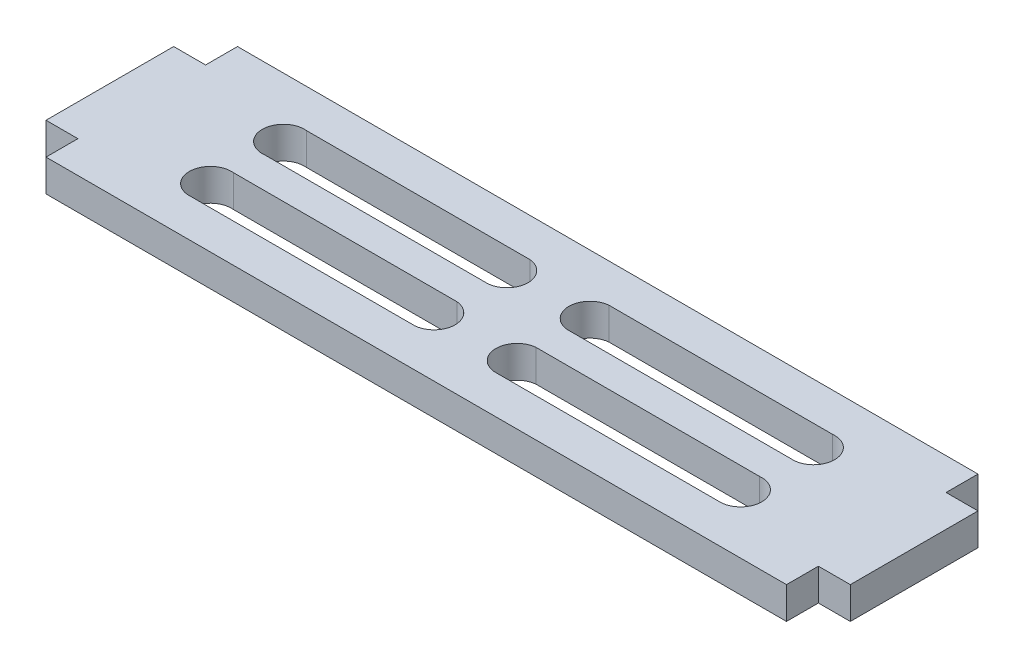
ISO-10303-21;
HEADER;
FILE_DESCRIPTION(('STEP AP214'),'2;1');
FILE_NAME('part.step','',(''),(''),'','','');
FILE_SCHEMA(('AUTOMOTIVE_DESIGN { 1 0 10303 214 1 1 1 1 }'));
ENDSEC;
DATA;
#1=APPLICATION_CONTEXT('core data for automotive mechanical design processes');
#2=APPLICATION_PROTOCOL_DEFINITION('international standard','automotive_design',2000,#1);
#3=PRODUCT_CONTEXT('',#1,'mechanical');
#4=PRODUCT('Part','Part','',(#3));
#5=PRODUCT_RELATED_PRODUCT_CATEGORY('part','',(#4));
#6=PRODUCT_DEFINITION_FORMATION('','',#4);
#7=PRODUCT_DEFINITION_CONTEXT('part definition',#1,'design');
#8=PRODUCT_DEFINITION('design','',#6,#7);
#9=PRODUCT_DEFINITION_SHAPE('','',#8);
#10=(LENGTH_UNIT() NAMED_UNIT(*) SI_UNIT(.MILLI.,.METRE.));
#11=(NAMED_UNIT(*) PLANE_ANGLE_UNIT() SI_UNIT($,.RADIAN.));
#12=(NAMED_UNIT(*) SI_UNIT($,.STERADIAN.) SOLID_ANGLE_UNIT());
#13=UNCERTAINTY_MEASURE_WITH_UNIT(LENGTH_MEASURE(1.E-05),#10,'distance_accuracy_value','');
#14=(GEOMETRIC_REPRESENTATION_CONTEXT(3) GLOBAL_UNCERTAINTY_ASSIGNED_CONTEXT((#13)) GLOBAL_UNIT_ASSIGNED_CONTEXT((#10,
#11,#12)) REPRESENTATION_CONTEXT('',''));
#15=CARTESIAN_POINT('',(0.,0.,0.));
#16=DIRECTION('',(0.,0.,1.));
#17=DIRECTION('',(1.,0.,0.));
#18=AXIS2_PLACEMENT_3D('',#15,#16,#17);
#19=CARTESIAN_POINT('',(0.,5.,0.));
#20=DIRECTION('',(0.,1.,0.));
#21=DIRECTION('',(0.,0.,1.));
#22=AXIS2_PLACEMENT_3D('',#19,#20,#21);
#23=PLANE('',#22);
#24=DIRECTION('',(0.,0.,-1.));
#25=VECTOR('',#24,1.);
#26=CARTESIAN_POINT('',(95.0892982050154,5.,11.6910229031955));
#27=LINE('',#26,#25);
#28=CARTESIAN_POINT('',(95.0892982050154,5.,16.6910229031955));
#29=VERTEX_POINT('',#28);
#30=CARTESIAN_POINT('',(95.0892982050154,5.,11.6910229031955));
#31=VERTEX_POINT('',#30);
#32=EDGE_CURVE('E349',#29,#31,#27,.T.);
#33=ORIENTED_EDGE('',*,*,#32,.T.);
#34=DIRECTION('',(1.,0.,0.));
#35=VECTOR('',#34,1.);
#36=CARTESIAN_POINT('',(95.0892982050154,5.,11.6910229031955));
#37=LINE('',#36,#35);
#38=CARTESIAN_POINT('',(100.089298205015,5.,11.6910229031955));
#39=VERTEX_POINT('',#38);
#40=EDGE_CURVE('E352',#31,#39,#37,.T.);
#41=ORIENTED_EDGE('',*,*,#40,.T.);
#42=DIRECTION('',(0.,0.,-1.));
#43=VECTOR('',#42,1.);
#44=CARTESIAN_POINT('',(100.089298205015,5.,-8.30897709680451));
#45=LINE('',#44,#43);
#46=CARTESIAN_POINT('',(100.089298205015,5.,-8.30897709680451));
#47=VERTEX_POINT('',#46);
#48=EDGE_CURVE('E355',#39,#47,#45,.T.);
#49=ORIENTED_EDGE('',*,*,#48,.T.);
#50=DIRECTION('',(-1.,0.,0.));
#51=VECTOR('',#50,1.);
#52=CARTESIAN_POINT('',(95.0892982050154,5.,-8.30897709680451));
#53=LINE('',#52,#51);
#54=CARTESIAN_POINT('',(95.0892982050154,5.,-8.30897709680451));
#55=VERTEX_POINT('',#54);
#56=EDGE_CURVE('E357',#47,#55,#53,.T.);
#57=ORIENTED_EDGE('',*,*,#56,.T.);
#58=DIRECTION('',(0.,0.,-1.));
#59=VECTOR('',#58,1.);
#60=CARTESIAN_POINT('',(95.0892982050154,5.,-13.3089770968045));
#61=LINE('',#60,#59);
#62=CARTESIAN_POINT('',(95.0892982050154,5.,-13.3089770968045));
#63=VERTEX_POINT('',#62);
#64=EDGE_CURVE('E359',#55,#63,#61,.T.);
#65=ORIENTED_EDGE('',*,*,#64,.T.);
#66=DIRECTION('',(-1.,0.,0.));
#67=VECTOR('',#66,1.);
#68=CARTESIAN_POINT('',(51.5892982050154,5.,-13.3089770968045));
#69=LINE('',#68,#67);
#70=CARTESIAN_POINT('',(-20.9107017949846,5.,-13.3089770968045));
#71=VERTEX_POINT('',#70);
#72=EDGE_CURVE('E361',#63,#71,#69,.T.);
#73=ORIENTED_EDGE('',*,*,#72,.T.);
#74=DIRECTION('',(0.,0.,1.));
#75=VECTOR('',#74,1.);
#76=CARTESIAN_POINT('',(-20.9107017949846,5.,-13.3089770968045));
#77=LINE('',#76,#75);
#78=CARTESIAN_POINT('',(-20.9107017949846,5.,-8.30897709680451));
#79=VERTEX_POINT('',#78);
#80=EDGE_CURVE('E363',#71,#79,#77,.T.);
#81=ORIENTED_EDGE('',*,*,#80,.T.);
#82=DIRECTION('',(-1.,0.,0.));
#83=VECTOR('',#82,1.);
#84=CARTESIAN_POINT('',(-20.9107017949846,5.,-8.30897709680451));
#85=LINE('',#84,#83);
#86=CARTESIAN_POINT('',(-25.9107017949846,5.,-8.30897709680452));
#87=VERTEX_POINT('',#86);
#88=EDGE_CURVE('E365',#79,#87,#85,.T.);
#89=ORIENTED_EDGE('',*,*,#88,.T.);
#90=DIRECTION('',(0.,0.,1.));
#91=VECTOR('',#90,1.);
#92=CARTESIAN_POINT('',(-25.9107017949846,5.,-8.30897709680452));
#93=LINE('',#92,#91);
#94=CARTESIAN_POINT('',(-25.9107017949846,5.,11.6910229031955));
#95=VERTEX_POINT('',#94);
#96=EDGE_CURVE('E367',#87,#95,#93,.T.);
#97=ORIENTED_EDGE('',*,*,#96,.T.);
#98=DIRECTION('',(1.,0.,0.));
#99=VECTOR('',#98,1.);
#100=CARTESIAN_POINT('',(-20.9107017949846,5.,11.6910229031955));
#101=LINE('',#100,#99);
#102=CARTESIAN_POINT('',(-20.9107017949846,5.,11.6910229031955));
#103=VERTEX_POINT('',#102);
#104=EDGE_CURVE('E369',#95,#103,#101,.T.);
#105=ORIENTED_EDGE('',*,*,#104,.T.);
#106=DIRECTION('',(0.,0.,1.));
#107=VECTOR('',#106,1.);
#108=CARTESIAN_POINT('',(-20.9107017949846,5.,11.6910229031955));
#109=LINE('',#108,#107);
#110=CARTESIAN_POINT('',(-20.9107017949846,5.,16.6910229031955));
#111=VERTEX_POINT('',#110);
#112=EDGE_CURVE('E371',#103,#111,#109,.T.);
#113=ORIENTED_EDGE('',*,*,#112,.T.);
#114=DIRECTION('',(1.,0.,0.));
#115=VECTOR('',#114,1.);
#116=CARTESIAN_POINT('',(-20.9107017949846,5.,16.6910229031955));
#117=LINE('',#116,#115);
#118=EDGE_CURVE('E373',#111,#29,#117,.T.);
#119=ORIENTED_EDGE('',*,*,#118,.T.);
#120=EDGE_LOOP('',(#33,#41,#49,#57,#65,#73,#81,#89,#97,#105,#113,#119));
#121=FACE_BOUND('',#120,.T.);
#122=DIRECTION('',(1.,0.,0.));
#123=VECTOR('',#122,1.);
#124=CARTESIAN_POINT('',(-4.09292982060812,5.,10.6910229031955));
#125=LINE('',#124,#123);
#126=CARTESIAN_POINT('',(-4.09292982060812,5.,10.6910229031955));
#127=VERTEX_POINT('',#126);
#128=CARTESIAN_POINT('',(30.9070701793919,5.,10.6910229031955));
#129=VERTEX_POINT('',#128);
#130=EDGE_CURVE('E320',#127,#129,#125,.T.);
#131=ORIENTED_EDGE('',*,*,#130,.F.);
#132=CARTESIAN_POINT('',(-4.43867562482222,5.,7.40643776316124));
#133=DIRECTION('',(0.,1.,0.));
#134=DIRECTION('',(0.,0.,1.));
#135=AXIS2_PLACEMENT_3D('',#132,#133,#134);
#136=CIRCLE('',#135,3.30273215736084);
#137=CARTESIAN_POINT('',(-4.0929298206081,5.,4.121852623127));
#138=VERTEX_POINT('',#137);
#139=EDGE_CURVE('E318',#138,#127,#136,.T.);
#140=ORIENTED_EDGE('',*,*,#139,.F.);
#141=DIRECTION('',(-1.,0.,0.));
#142=VECTOR('',#141,1.);
#143=CARTESIAN_POINT('',(-4.0929298206081,5.,4.121852623127));
#144=LINE('',#143,#142);
#145=CARTESIAN_POINT('',(30.9070701793919,5.,4.121852623127));
#146=VERTEX_POINT('',#145);
#147=EDGE_CURVE('E326',#146,#138,#144,.T.);
#148=ORIENTED_EDGE('',*,*,#147,.F.);
#149=CARTESIAN_POINT('',(30.5884788143704,5.,7.40643776316124));
#150=DIRECTION('',(0.,1.,0.));
#151=DIRECTION('',(0.,0.,-1.));
#152=AXIS2_PLACEMENT_3D('',#149,#150,#151);
#153=CIRCLE('',#152,3.3);
#154=EDGE_CURVE('E323',#129,#146,#153,.T.);
#155=ORIENTED_EDGE('',*,*,#154,.F.);
#156=EDGE_LOOP('',(#131,#140,#148,#155));
#157=FACE_BOUND('',#156,.T.);
#158=DIRECTION('',(-1.,0.,0.));
#159=VECTOR('',#158,1.);
#160=CARTESIAN_POINT('',(-4.09292982060812,5.,-7.3089770968045));
#161=LINE('',#160,#159);
#162=CARTESIAN_POINT('',(30.9070701793919,5.,-7.3089770968045));
#163=VERTEX_POINT('',#162);
#164=CARTESIAN_POINT('',(-4.09292982060812,5.,-7.3089770968045));
#165=VERTEX_POINT('',#164);
#166=EDGE_CURVE('E289',#163,#165,#161,.T.);
#167=ORIENTED_EDGE('',*,*,#166,.F.);
#168=CARTESIAN_POINT('',(30.5884788143704,5.,-4.02439195677026));
#169=DIRECTION('',(0.,1.,0.));
#170=DIRECTION('',(0.,0.,1.));
#171=AXIS2_PLACEMENT_3D('',#168,#169,#170);
#172=CIRCLE('',#171,3.3);
#173=CARTESIAN_POINT('',(30.9070701793919,5.,-0.739806816736021));
#174=VERTEX_POINT('',#173);
#175=EDGE_CURVE('E287',#174,#163,#172,.T.);
#176=ORIENTED_EDGE('',*,*,#175,.F.);
#177=DIRECTION('',(1.,0.,0.));
#178=VECTOR('',#177,1.);
#179=CARTESIAN_POINT('',(-4.0929298206081,5.,-0.739806816736021));
#180=LINE('',#179,#178);
#181=CARTESIAN_POINT('',(-4.0929298206081,5.,-0.739806816736021));
#182=VERTEX_POINT('',#181);
#183=EDGE_CURVE('E295',#182,#174,#180,.T.);
#184=ORIENTED_EDGE('',*,*,#183,.F.);
#185=CARTESIAN_POINT('',(-4.43867562482222,5.,-4.02439195677026));
#186=DIRECTION('',(0.,1.,0.));
#187=DIRECTION('',(0.,0.,-1.));
#188=AXIS2_PLACEMENT_3D('',#185,#186,#187);
#189=CIRCLE('',#188,3.30273215736084);
#190=EDGE_CURVE('E292',#165,#182,#189,.T.);
#191=ORIENTED_EDGE('',*,*,#190,.F.);
#192=EDGE_LOOP('',(#167,#176,#184,#191));
#193=FACE_BOUND('',#192,.T.);
#194=DIRECTION('',(1.,0.,0.));
#195=VECTOR('',#194,1.);
#196=CARTESIAN_POINT('',(78.2715262306389,5.,10.6910229031955));
#197=LINE('',#196,#195);
#198=CARTESIAN_POINT('',(43.2715262306389,5.,10.6910229031955));
#199=VERTEX_POINT('',#198);
#200=CARTESIAN_POINT('',(78.2715262306389,5.,10.6910229031955));
#201=VERTEX_POINT('',#200);
#202=EDGE_CURVE('E258',#199,#201,#197,.T.);
#203=ORIENTED_EDGE('',*,*,#202,.F.);
#204=CARTESIAN_POINT('',(43.5901175956604,5.,7.40643776316123));
#205=DIRECTION('',(0.,1.,0.));
#206=DIRECTION('',(0.,0.,1.));
#207=AXIS2_PLACEMENT_3D('',#204,#205,#206);
#208=CIRCLE('',#207,3.3);
#209=CARTESIAN_POINT('',(43.2715262306389,5.,4.12185262312699));
#210=VERTEX_POINT('',#209);
#211=EDGE_CURVE('E256',#210,#199,#208,.T.);
#212=ORIENTED_EDGE('',*,*,#211,.F.);
#213=DIRECTION('',(-1.,0.,0.));
#214=VECTOR('',#213,1.);
#215=CARTESIAN_POINT('',(78.2715262306389,5.,4.12185262312699));
#216=LINE('',#215,#214);
#217=CARTESIAN_POINT('',(78.2715262306389,5.,4.12185262312699));
#218=VERTEX_POINT('',#217);
#219=EDGE_CURVE('E264',#218,#210,#216,.T.);
#220=ORIENTED_EDGE('',*,*,#219,.F.);
#221=CARTESIAN_POINT('',(78.617272034853,5.,7.40643776316123));
#222=DIRECTION('',(0.,1.,0.));
#223=DIRECTION('',(0.,0.,-1.));
#224=AXIS2_PLACEMENT_3D('',#221,#222,#223);
#225=CIRCLE('',#224,3.30273215736084);
#226=EDGE_CURVE('E261',#201,#218,#225,.T.);
#227=ORIENTED_EDGE('',*,*,#226,.F.);
#228=EDGE_LOOP('',(#203,#212,#220,#227));
#229=FACE_BOUND('',#228,.T.);
#230=DIRECTION('',(-1.,0.,0.));
#231=VECTOR('',#230,1.);
#232=CARTESIAN_POINT('',(78.2715262306389,5.,-7.30897709680449));
#233=LINE('',#232,#231);
#234=CARTESIAN_POINT('',(78.2715262306389,5.,-7.30897709680449));
#235=VERTEX_POINT('',#234);
#236=CARTESIAN_POINT('',(43.2715262306389,5.,-7.30897709680449));
#237=VERTEX_POINT('',#236);
#238=EDGE_CURVE('E228',#235,#237,#233,.T.);
#239=ORIENTED_EDGE('',*,*,#238,.F.);
#240=CARTESIAN_POINT('',(78.617272034853,5.,-4.02439195677025));
#241=DIRECTION('',(0.,1.,0.));
#242=DIRECTION('',(0.,0.,1.));
#243=AXIS2_PLACEMENT_3D('',#240,#241,#242);
#244=CIRCLE('',#243,3.30273215736084);
#245=CARTESIAN_POINT('',(78.2715262306389,5.,-0.739806816736014));
#246=VERTEX_POINT('',#245);
#247=EDGE_CURVE('E220',#246,#235,#244,.T.);
#248=ORIENTED_EDGE('',*,*,#247,.F.);
#249=DIRECTION('',(1.,0.,0.));
#250=VECTOR('',#249,1.);
#251=CARTESIAN_POINT('',(78.2715262306389,5.,-0.739806816736014));
#252=LINE('',#251,#250);
#253=CARTESIAN_POINT('',(43.2715262306389,5.,-0.739806816736014));
#254=VERTEX_POINT('',#253);
#255=EDGE_CURVE('E242',#254,#246,#252,.T.);
#256=ORIENTED_EDGE('',*,*,#255,.F.);
#257=CARTESIAN_POINT('',(43.5901175956604,5.,-4.02439195677025));
#258=DIRECTION('',(0.,1.,0.));
#259=DIRECTION('',(0.,0.,-1.));
#260=AXIS2_PLACEMENT_3D('',#257,#258,#259);
#261=CIRCLE('',#260,3.3);
#262=EDGE_CURVE('E240',#237,#254,#261,.T.);
#263=ORIENTED_EDGE('',*,*,#262,.F.);
#264=EDGE_LOOP('',(#239,#248,#256,#263));
#265=FACE_BOUND('',#264,.T.);
#266=ADVANCED_FACE('F35',(#121,#157,#193,#229,#265),#23,.T.);
#267=CARTESIAN_POINT('',(0.,0.,0.));
#268=DIRECTION('',(0.,1.,0.));
#269=DIRECTION('',(0.,0.,1.));
#270=AXIS2_PLACEMENT_3D('',#267,#268,#269);
#271=PLANE('',#270);
#272=CARTESIAN_POINT('',(43.5901175956604,0.,7.40643776316123));
#273=DIRECTION('',(0.,1.,0.));
#274=DIRECTION('',(0.,0.,1.));
#275=AXIS2_PLACEMENT_3D('',#272,#273,#274);
#276=CIRCLE('',#275,3.3);
#277=CARTESIAN_POINT('',(43.2715262306389,0.,4.12185262312699));
#278=VERTEX_POINT('',#277);
#279=CARTESIAN_POINT('',(43.2715262306389,0.,10.6910229031955));
#280=VERTEX_POINT('',#279);
#281=EDGE_CURVE('E236',#278,#280,#276,.T.);
#282=ORIENTED_EDGE('',*,*,#281,.T.);
#283=DIRECTION('',(1.,0.,0.));
#284=VECTOR('',#283,1.);
#285=CARTESIAN_POINT('',(78.2715262306389,0.,10.6910229031955));
#286=LINE('',#285,#284);
#287=CARTESIAN_POINT('',(78.2715262306389,0.,10.6910229031955));
#288=VERTEX_POINT('',#287);
#289=EDGE_CURVE('E269',#280,#288,#286,.T.);
#290=ORIENTED_EDGE('',*,*,#289,.T.);
#291=CARTESIAN_POINT('',(78.617272034853,0.,7.40643776316123));
#292=DIRECTION('',(0.,1.,0.));
#293=DIRECTION('',(0.,0.,-1.));
#294=AXIS2_PLACEMENT_3D('',#291,#292,#293);
#295=CIRCLE('',#294,3.30273215736084);
#296=CARTESIAN_POINT('',(78.2715262306389,0.,4.12185262312699));
#297=VERTEX_POINT('',#296);
#298=EDGE_CURVE('E272',#288,#297,#295,.T.);
#299=ORIENTED_EDGE('',*,*,#298,.T.);
#300=DIRECTION('',(-1.,0.,0.));
#301=VECTOR('',#300,1.);
#302=CARTESIAN_POINT('',(78.2715262306389,0.,4.12185262312699));
#303=LINE('',#302,#301);
#304=EDGE_CURVE('E259',#297,#278,#303,.T.);
#305=ORIENTED_EDGE('',*,*,#304,.T.);
#306=EDGE_LOOP('',(#282,#290,#299,#305));
#307=FACE_BOUND('',#306,.T.);
#308=CARTESIAN_POINT('',(-4.43867562482222,0.,7.40643776316124));
#309=DIRECTION('',(0.,1.,0.));
#310=DIRECTION('',(0.,0.,1.));
#311=AXIS2_PLACEMENT_3D('',#308,#309,#310);
#312=CIRCLE('',#311,3.30273215736084);
#313=CARTESIAN_POINT('',(-4.0929298206081,0.,4.121852623127));
#314=VERTEX_POINT('',#313);
#315=CARTESIAN_POINT('',(-4.09292982060812,0.,10.6910229031955));
#316=VERTEX_POINT('',#315);
#317=EDGE_CURVE('E317',#314,#316,#312,.T.);
#318=ORIENTED_EDGE('',*,*,#317,.T.);
#319=DIRECTION('',(1.,0.,0.));
#320=VECTOR('',#319,1.);
#321=CARTESIAN_POINT('',(-4.09292982060812,0.,10.6910229031955));
#322=LINE('',#321,#320);
#323=CARTESIAN_POINT('',(30.9070701793919,0.,10.6910229031955));
#324=VERTEX_POINT('',#323);
#325=EDGE_CURVE('E331',#316,#324,#322,.T.);
#326=ORIENTED_EDGE('',*,*,#325,.T.);
#327=CARTESIAN_POINT('',(30.5884788143704,0.,7.40643776316124));
#328=DIRECTION('',(0.,1.,0.));
#329=DIRECTION('',(0.,0.,-1.));
#330=AXIS2_PLACEMENT_3D('',#327,#328,#329);
#331=CIRCLE('',#330,3.3);
#332=CARTESIAN_POINT('',(30.9070701793919,0.,4.121852623127));
#333=VERTEX_POINT('',#332);
#334=EDGE_CURVE('E334',#324,#333,#331,.T.);
#335=ORIENTED_EDGE('',*,*,#334,.T.);
#336=DIRECTION('',(-1.,0.,0.));
#337=VECTOR('',#336,1.);
#338=CARTESIAN_POINT('',(-4.0929298206081,0.,4.121852623127));
#339=LINE('',#338,#337);
#340=EDGE_CURVE('E321',#333,#314,#339,.T.);
#341=ORIENTED_EDGE('',*,*,#340,.T.);
#342=EDGE_LOOP('',(#318,#326,#335,#341));
#343=FACE_BOUND('',#342,.T.);
#344=DIRECTION('',(0.,0.,-1.));
#345=VECTOR('',#344,1.);
#346=CARTESIAN_POINT('',(95.0892982050154,0.,11.6910229031955));
#347=LINE('',#346,#345);
#348=CARTESIAN_POINT('',(95.0892982050154,0.,16.6910229031955));
#349=VERTEX_POINT('',#348);
#350=CARTESIAN_POINT('',(95.0892982050154,0.,11.6910229031955));
#351=VERTEX_POINT('',#350);
#352=EDGE_CURVE('E348',#349,#351,#347,.T.);
#353=ORIENTED_EDGE('',*,*,#352,.F.);
#354=DIRECTION('',(1.,0.,0.));
#355=VECTOR('',#354,1.);
#356=CARTESIAN_POINT('',(-20.9107017949846,0.,16.6910229031955));
#357=LINE('',#356,#355);
#358=CARTESIAN_POINT('',(-20.9107017949846,0.,16.6910229031955));
#359=VERTEX_POINT('',#358);
#360=EDGE_CURVE('E353',#359,#349,#357,.T.);
#361=ORIENTED_EDGE('',*,*,#360,.F.);
#362=DIRECTION('',(0.,0.,1.));
#363=VECTOR('',#362,1.);
#364=CARTESIAN_POINT('',(-20.9107017949846,0.,11.6910229031955));
#365=LINE('',#364,#363);
#366=CARTESIAN_POINT('',(-20.9107017949846,0.,11.6910229031955));
#367=VERTEX_POINT('',#366);
#368=EDGE_CURVE('E397',#367,#359,#365,.T.);
#369=ORIENTED_EDGE('',*,*,#368,.F.);
#370=DIRECTION('',(1.,0.,0.));
#371=VECTOR('',#370,1.);
#372=CARTESIAN_POINT('',(-20.9107017949846,0.,11.6910229031955));
#373=LINE('',#372,#371);
#374=CARTESIAN_POINT('',(-25.9107017949846,0.,11.6910229031955));
#375=VERTEX_POINT('',#374);
#376=EDGE_CURVE('E395',#375,#367,#373,.T.);
#377=ORIENTED_EDGE('',*,*,#376,.F.);
#378=DIRECTION('',(0.,0.,1.));
#379=VECTOR('',#378,1.);
#380=CARTESIAN_POINT('',(-25.9107017949846,0.,-8.30897709680452));
#381=LINE('',#380,#379);
#382=CARTESIAN_POINT('',(-25.9107017949846,0.,-8.30897709680452));
#383=VERTEX_POINT('',#382);
#384=EDGE_CURVE('E393',#383,#375,#381,.T.);
#385=ORIENTED_EDGE('',*,*,#384,.F.);
#386=DIRECTION('',(-1.,0.,0.));
#387=VECTOR('',#386,1.);
#388=CARTESIAN_POINT('',(-20.9107017949846,0.,-8.30897709680451));
#389=LINE('',#388,#387);
#390=CARTESIAN_POINT('',(-20.9107017949846,0.,-8.30897709680451));
#391=VERTEX_POINT('',#390);
#392=EDGE_CURVE('E391',#391,#383,#389,.T.);
#393=ORIENTED_EDGE('',*,*,#392,.F.);
#394=DIRECTION('',(0.,0.,1.));
#395=VECTOR('',#394,1.);
#396=CARTESIAN_POINT('',(-20.9107017949846,0.,-13.3089770968045));
#397=LINE('',#396,#395);
#398=CARTESIAN_POINT('',(-20.9107017949846,0.,-13.3089770968045));
#399=VERTEX_POINT('',#398);
#400=EDGE_CURVE('E389',#399,#391,#397,.T.);
#401=ORIENTED_EDGE('',*,*,#400,.F.);
#402=DIRECTION('',(-1.,0.,0.));
#403=VECTOR('',#402,1.);
#404=CARTESIAN_POINT('',(22.5892982050154,0.,-13.3089770968045));
#405=LINE('',#404,#403);
#406=CARTESIAN_POINT('',(95.0892982050154,0.,-13.3089770968045));
#407=VERTEX_POINT('',#406);
#408=EDGE_CURVE('E387',#407,#399,#405,.T.);
#409=ORIENTED_EDGE('',*,*,#408,.F.);
#410=DIRECTION('',(0.,0.,-1.));
#411=VECTOR('',#410,1.);
#412=CARTESIAN_POINT('',(95.0892982050154,0.,-13.3089770968045));
#413=LINE('',#412,#411);
#414=CARTESIAN_POINT('',(95.0892982050154,0.,-8.30897709680451));
#415=VERTEX_POINT('',#414);
#416=EDGE_CURVE('E384',#415,#407,#413,.T.);
#417=ORIENTED_EDGE('',*,*,#416,.F.);
#418=DIRECTION('',(-1.,0.,0.));
#419=VECTOR('',#418,1.);
#420=CARTESIAN_POINT('',(95.0892982050154,0.,-8.30897709680451));
#421=LINE('',#420,#419);
#422=CARTESIAN_POINT('',(100.089298205015,0.,-8.30897709680451));
#423=VERTEX_POINT('',#422);
#424=EDGE_CURVE('E382',#423,#415,#421,.T.);
#425=ORIENTED_EDGE('',*,*,#424,.F.);
#426=DIRECTION('',(0.,0.,-1.));
#427=VECTOR('',#426,1.);
#428=CARTESIAN_POINT('',(100.089298205015,0.,-8.30897709680451));
#429=LINE('',#428,#427);
#430=CARTESIAN_POINT('',(100.089298205015,0.,11.6910229031955));
#431=VERTEX_POINT('',#430);
#432=EDGE_CURVE('E380',#431,#423,#429,.T.);
#433=ORIENTED_EDGE('',*,*,#432,.F.);
#434=DIRECTION('',(1.,0.,0.));
#435=VECTOR('',#434,1.);
#436=CARTESIAN_POINT('',(95.0892982050154,0.,11.6910229031955));
#437=LINE('',#436,#435);
#438=EDGE_CURVE('E378',#351,#431,#437,.T.);
#439=ORIENTED_EDGE('',*,*,#438,.F.);
#440=EDGE_LOOP('',(#353,#361,#369,#377,#385,#393,#401,#409,#417,#425,#433,#439));
#441=FACE_BOUND('',#440,.T.);
#442=CARTESIAN_POINT('',(30.5884788143704,0.,-4.02439195677026));
#443=DIRECTION('',(0.,1.,0.));
#444=DIRECTION('',(0.,0.,1.));
#445=AXIS2_PLACEMENT_3D('',#442,#443,#444);
#446=CIRCLE('',#445,3.3);
#447=CARTESIAN_POINT('',(30.9070701793919,0.,-0.739806816736021));
#448=VERTEX_POINT('',#447);
#449=CARTESIAN_POINT('',(30.9070701793919,0.,-7.3089770968045));
#450=VERTEX_POINT('',#449);
#451=EDGE_CURVE('E286',#448,#450,#446,.T.);
#452=ORIENTED_EDGE('',*,*,#451,.T.);
#453=DIRECTION('',(-1.,0.,0.));
#454=VECTOR('',#453,1.);
#455=CARTESIAN_POINT('',(-4.09292982060812,0.,-7.3089770968045));
#456=LINE('',#455,#454);
#457=CARTESIAN_POINT('',(-4.09292982060812,0.,-7.3089770968045));
#458=VERTEX_POINT('',#457);
#459=EDGE_CURVE('E300',#450,#458,#456,.T.);
#460=ORIENTED_EDGE('',*,*,#459,.T.);
#461=CARTESIAN_POINT('',(-4.43867562482222,0.,-4.02439195677026));
#462=DIRECTION('',(0.,1.,0.));
#463=DIRECTION('',(0.,0.,-1.));
#464=AXIS2_PLACEMENT_3D('',#461,#462,#463);
#465=CIRCLE('',#464,3.30273215736084);
#466=CARTESIAN_POINT('',(-4.0929298206081,0.,-0.739806816736021));
#467=VERTEX_POINT('',#466);
#468=EDGE_CURVE('E303',#458,#467,#465,.T.);
#469=ORIENTED_EDGE('',*,*,#468,.T.);
#470=DIRECTION('',(1.,0.,0.));
#471=VECTOR('',#470,1.);
#472=CARTESIAN_POINT('',(-4.0929298206081,0.,-0.739806816736021));
#473=LINE('',#472,#471);
#474=EDGE_CURVE('E290',#467,#448,#473,.T.);
#475=ORIENTED_EDGE('',*,*,#474,.T.);
#476=EDGE_LOOP('',(#452,#460,#469,#475));
#477=FACE_BOUND('',#476,.T.);
#478=CARTESIAN_POINT('',(78.617272034853,0.,-4.02439195677025));
#479=DIRECTION('',(0.,1.,0.));
#480=DIRECTION('',(0.,0.,1.));
#481=AXIS2_PLACEMENT_3D('',#478,#479,#480);
#482=CIRCLE('',#481,3.30273215736084);
#483=CARTESIAN_POINT('',(78.2715262306389,0.,-0.739806816736014));
#484=VERTEX_POINT('',#483);
#485=CARTESIAN_POINT('',(78.2715262306389,0.,-7.30897709680449));
#486=VERTEX_POINT('',#485);
#487=EDGE_CURVE('E58',#484,#486,#482,.T.);
#488=ORIENTED_EDGE('',*,*,#487,.T.);
#489=DIRECTION('',(-1.,0.,0.));
#490=VECTOR('',#489,1.);
#491=CARTESIAN_POINT('',(78.2715262306389,0.,-7.30897709680449));
#492=LINE('',#491,#490);
#493=CARTESIAN_POINT('',(43.2715262306389,0.,-7.30897709680449));
#494=VERTEX_POINT('',#493);
#495=EDGE_CURVE('E235',#486,#494,#492,.T.);
#496=ORIENTED_EDGE('',*,*,#495,.T.);
#497=CARTESIAN_POINT('',(43.5901175956604,0.,-4.02439195677025));
#498=DIRECTION('',(0.,1.,0.));
#499=DIRECTION('',(0.,0.,-1.));
#500=AXIS2_PLACEMENT_3D('',#497,#498,#499);
#501=CIRCLE('',#500,3.3);
#502=CARTESIAN_POINT('',(43.2715262306389,0.,-0.739806816736014));
#503=VERTEX_POINT('',#502);
#504=EDGE_CURVE('E248',#494,#503,#501,.T.);
#505=ORIENTED_EDGE('',*,*,#504,.T.);
#506=DIRECTION('',(1.,0.,0.));
#507=VECTOR('',#506,1.);
#508=CARTESIAN_POINT('',(78.2715262306389,0.,-0.739806816736014));
#509=LINE('',#508,#507);
#510=EDGE_CURVE('E229',#503,#484,#509,.T.);
#511=ORIENTED_EDGE('',*,*,#510,.T.);
#512=EDGE_LOOP('',(#488,#496,#505,#511));
#513=FACE_BOUND('',#512,.T.);
#514=ADVANCED_FACE('F439',(#307,#343,#441,#477,#513),#271,.F.);
#515=CARTESIAN_POINT('',(95.0892982050154,5.,11.6910229031955));
#516=DIRECTION('',(-1.,0.,0.));
#517=DIRECTION('',(0.,0.,1.));
#518=AXIS2_PLACEMENT_3D('',#515,#516,#517);
#519=PLANE('',#518);
#520=ORIENTED_EDGE('',*,*,#352,.T.);
#521=DIRECTION('',(0.,-1.,0.));
#522=VECTOR('',#521,1.);
#523=CARTESIAN_POINT('',(95.0892982050154,5.,11.6910229031955));
#524=LINE('',#523,#522);
#525=EDGE_CURVE('E11',#31,#351,#524,.T.);
#526=ORIENTED_EDGE('',*,*,#525,.F.);
#527=ORIENTED_EDGE('',*,*,#32,.F.);
#528=DIRECTION('',(0.,-1.,0.));
#529=VECTOR('',#528,1.);
#530=CARTESIAN_POINT('',(95.0892982050154,5.,16.6910229031955));
#531=LINE('',#530,#529);
#532=EDGE_CURVE('E375',#29,#349,#531,.T.);
#533=ORIENTED_EDGE('',*,*,#532,.T.);
#534=EDGE_LOOP('',(#520,#526,#527,#533));
#535=FACE_BOUND('',#534,.T.);
#536=ADVANCED_FACE('F37',(#535),#519,.F.);
#537=CARTESIAN_POINT('',(95.0892982050154,5.,11.6910229031955));
#538=DIRECTION('',(0.,0.,-1.));
#539=DIRECTION('',(-1.,0.,0.));
#540=AXIS2_PLACEMENT_3D('',#537,#538,#539);
#541=PLANE('',#540);
#542=ORIENTED_EDGE('',*,*,#438,.T.);
#543=DIRECTION('',(0.,-1.,0.));
#544=VECTOR('',#543,1.);
#545=CARTESIAN_POINT('',(100.089298205015,5.,11.6910229031955));
#546=LINE('',#545,#544);
#547=EDGE_CURVE('E43',#39,#431,#546,.T.);
#548=ORIENTED_EDGE('',*,*,#547,.F.);
#549=ORIENTED_EDGE('',*,*,#40,.F.);
#550=ORIENTED_EDGE('',*,*,#525,.T.);
#551=EDGE_LOOP('',(#542,#548,#549,#550));
#552=FACE_BOUND('',#551,.T.);
#553=ADVANCED_FACE('F456',(#552),#541,.F.);
#554=CARTESIAN_POINT('',(100.089298205015,5.,-8.30897709680451));
#555=DIRECTION('',(-1.,0.,0.));
#556=DIRECTION('',(0.,0.,1.));
#557=AXIS2_PLACEMENT_3D('',#554,#555,#556);
#558=PLANE('',#557);
#559=ORIENTED_EDGE('',*,*,#432,.T.);
#560=DIRECTION('',(0.,-1.,0.));
#561=VECTOR('',#560,1.);
#562=CARTESIAN_POINT('',(100.089298205015,5.,-8.30897709680451));
#563=LINE('',#562,#561);
#564=EDGE_CURVE('E426',#47,#423,#563,.T.);
#565=ORIENTED_EDGE('',*,*,#564,.F.);
#566=ORIENTED_EDGE('',*,*,#48,.F.);
#567=ORIENTED_EDGE('',*,*,#547,.T.);
#568=EDGE_LOOP('',(#559,#565,#566,#567));
#569=FACE_BOUND('',#568,.T.);
#570=ADVANCED_FACE('F433',(#569),#558,.F.);
#571=CARTESIAN_POINT('',(95.0892982050154,5.,-8.30897709680451));
#572=DIRECTION('',(0.,0.,1.));
#573=DIRECTION('',(1.,0.,0.));
#574=AXIS2_PLACEMENT_3D('',#571,#572,#573);
#575=PLANE('',#574);
#576=ORIENTED_EDGE('',*,*,#424,.T.);
#577=DIRECTION('',(0.,-1.,0.));
#578=VECTOR('',#577,1.);
#579=CARTESIAN_POINT('',(95.0892982050154,5.,-8.30897709680451));
#580=LINE('',#579,#578);
#581=EDGE_CURVE('E423',#55,#415,#580,.T.);
#582=ORIENTED_EDGE('',*,*,#581,.F.);
#583=ORIENTED_EDGE('',*,*,#56,.F.);
#584=ORIENTED_EDGE('',*,*,#564,.T.);
#585=EDGE_LOOP('',(#576,#582,#583,#584));
#586=FACE_BOUND('',#585,.T.);
#587=ADVANCED_FACE('F444',(#586),#575,.F.);
#588=CARTESIAN_POINT('',(95.0892982050154,5.,-13.3089770968045));
#589=DIRECTION('',(-1.,0.,0.));
#590=DIRECTION('',(0.,0.,1.));
#591=AXIS2_PLACEMENT_3D('',#588,#589,#590);
#592=PLANE('',#591);
#593=ORIENTED_EDGE('',*,*,#416,.T.);
#594=DIRECTION('',(0.,-1.,0.));
#595=VECTOR('',#594,1.);
#596=CARTESIAN_POINT('',(95.0892982050154,5.,-13.3089770968045));
#597=LINE('',#596,#595);
#598=EDGE_CURVE('E420',#63,#407,#597,.T.);
#599=ORIENTED_EDGE('',*,*,#598,.F.);
#600=ORIENTED_EDGE('',*,*,#64,.F.);
#601=ORIENTED_EDGE('',*,*,#581,.T.);
#602=EDGE_LOOP('',(#593,#599,#600,#601));
#603=FACE_BOUND('',#602,.T.);
#604=ADVANCED_FACE('F448',(#603),#592,.F.);
#605=CARTESIAN_POINT('',(22.5892982050154,5.,-13.3089770968045));
#606=DIRECTION('',(0.,0.,1.));
#607=DIRECTION('',(1.,0.,0.));
#608=AXIS2_PLACEMENT_3D('',#605,#606,#607);
#609=PLANE('',#608);
#610=ORIENTED_EDGE('',*,*,#408,.T.);
#611=DIRECTION('',(0.,-1.,0.));
#612=VECTOR('',#611,1.);
#613=CARTESIAN_POINT('',(-20.9107017949846,5.,-13.3089770968045));
#614=LINE('',#613,#612);
#615=EDGE_CURVE('E417',#71,#399,#614,.T.);
#616=ORIENTED_EDGE('',*,*,#615,.F.);
#617=ORIENTED_EDGE('',*,*,#72,.F.);
#618=ORIENTED_EDGE('',*,*,#598,.T.);
#619=EDGE_LOOP('',(#610,#616,#617,#618));
#620=FACE_BOUND('',#619,.T.);
#621=ADVANCED_FACE('F489',(#620),#609,.F.);
#622=CARTESIAN_POINT('',(-20.9107017949846,5.,-13.3089770968045));
#623=DIRECTION('',(1.,0.,0.));
#624=DIRECTION('',(0.,0.,-1.));
#625=AXIS2_PLACEMENT_3D('',#622,#623,#624);
#626=PLANE('',#625);
#627=ORIENTED_EDGE('',*,*,#400,.T.);
#628=DIRECTION('',(0.,-1.,0.));
#629=VECTOR('',#628,1.);
#630=CARTESIAN_POINT('',(-20.9107017949846,5.,-8.30897709680451));
#631=LINE('',#630,#629);
#632=EDGE_CURVE('E414',#79,#391,#631,.T.);
#633=ORIENTED_EDGE('',*,*,#632,.F.);
#634=ORIENTED_EDGE('',*,*,#80,.F.);
#635=ORIENTED_EDGE('',*,*,#615,.T.);
#636=EDGE_LOOP('',(#627,#633,#634,#635));
#637=FACE_BOUND('',#636,.T.);
#638=ADVANCED_FACE('F487',(#637),#626,.F.);
#639=CARTESIAN_POINT('',(-20.9107017949846,5.,-8.30897709680451));
#640=DIRECTION('',(0.,0.,1.));
#641=DIRECTION('',(1.,0.,0.));
#642=AXIS2_PLACEMENT_3D('',#639,#640,#641);
#643=PLANE('',#642);
#644=ORIENTED_EDGE('',*,*,#392,.T.);
#645=DIRECTION('',(0.,-1.,0.));
#646=VECTOR('',#645,1.);
#647=CARTESIAN_POINT('',(-25.9107017949846,5.,-8.30897709680452));
#648=LINE('',#647,#646);
#649=EDGE_CURVE('E411',#87,#383,#648,.T.);
#650=ORIENTED_EDGE('',*,*,#649,.F.);
#651=ORIENTED_EDGE('',*,*,#88,.F.);
#652=ORIENTED_EDGE('',*,*,#632,.T.);
#653=EDGE_LOOP('',(#644,#650,#651,#652));
#654=FACE_BOUND('',#653,.T.);
#655=ADVANCED_FACE('F483',(#654),#643,.F.);
#656=CARTESIAN_POINT('',(-25.9107017949846,5.,-8.30897709680452));
#657=DIRECTION('',(1.,0.,0.));
#658=DIRECTION('',(0.,0.,-1.));
#659=AXIS2_PLACEMENT_3D('',#656,#657,#658);
#660=PLANE('',#659);
#661=ORIENTED_EDGE('',*,*,#384,.T.);
#662=DIRECTION('',(0.,-1.,0.));
#663=VECTOR('',#662,1.);
#664=CARTESIAN_POINT('',(-25.9107017949846,5.,11.6910229031955));
#665=LINE('',#664,#663);
#666=EDGE_CURVE('E408',#95,#375,#665,.T.);
#667=ORIENTED_EDGE('',*,*,#666,.F.);
#668=ORIENTED_EDGE('',*,*,#96,.F.);
#669=ORIENTED_EDGE('',*,*,#649,.T.);
#670=EDGE_LOOP('',(#661,#667,#668,#669));
#671=FACE_BOUND('',#670,.T.);
#672=ADVANCED_FACE('F478',(#671),#660,.F.);
#673=CARTESIAN_POINT('',(-20.9107017949846,5.,11.6910229031955));
#674=DIRECTION('',(0.,0.,-1.));
#675=DIRECTION('',(-1.,0.,0.));
#676=AXIS2_PLACEMENT_3D('',#673,#674,#675);
#677=PLANE('',#676);
#678=ORIENTED_EDGE('',*,*,#376,.T.);
#679=DIRECTION('',(0.,-1.,0.));
#680=VECTOR('',#679,1.);
#681=CARTESIAN_POINT('',(-20.9107017949846,5.,11.6910229031955));
#682=LINE('',#681,#680);
#683=EDGE_CURVE('E405',#103,#367,#682,.T.);
#684=ORIENTED_EDGE('',*,*,#683,.F.);
#685=ORIENTED_EDGE('',*,*,#104,.F.);
#686=ORIENTED_EDGE('',*,*,#666,.T.);
#687=EDGE_LOOP('',(#678,#684,#685,#686));
#688=FACE_BOUND('',#687,.T.);
#689=ADVANCED_FACE('F472',(#688),#677,.F.);
#690=CARTESIAN_POINT('',(-20.9107017949846,5.,11.6910229031955));
#691=DIRECTION('',(1.,0.,0.));
#692=DIRECTION('',(0.,0.,-1.));
#693=AXIS2_PLACEMENT_3D('',#690,#691,#692);
#694=PLANE('',#693);
#695=ORIENTED_EDGE('',*,*,#368,.T.);
#696=DIRECTION('',(0.,-1.,0.));
#697=VECTOR('',#696,1.);
#698=CARTESIAN_POINT('',(-20.9107017949846,5.,16.6910229031955));
#699=LINE('',#698,#697);
#700=EDGE_CURVE('E402',#111,#359,#699,.T.);
#701=ORIENTED_EDGE('',*,*,#700,.F.);
#702=ORIENTED_EDGE('',*,*,#112,.F.);
#703=ORIENTED_EDGE('',*,*,#683,.T.);
#704=EDGE_LOOP('',(#695,#701,#702,#703));
#705=FACE_BOUND('',#704,.T.);
#706=ADVANCED_FACE('F468',(#705),#694,.F.);
#707=CARTESIAN_POINT('',(-20.9107017949846,5.,16.6910229031955));
#708=DIRECTION('',(0.,0.,-1.));
#709=DIRECTION('',(-1.,0.,0.));
#710=AXIS2_PLACEMENT_3D('',#707,#708,#709);
#711=PLANE('',#710);
#712=ORIENTED_EDGE('',*,*,#360,.T.);
#713=ORIENTED_EDGE('',*,*,#532,.F.);
#714=ORIENTED_EDGE('',*,*,#118,.F.);
#715=ORIENTED_EDGE('',*,*,#700,.T.);
#716=EDGE_LOOP('',(#712,#713,#714,#715));
#717=FACE_BOUND('',#716,.T.);
#718=ADVANCED_FACE('F463',(#717),#711,.F.);
#719=CARTESIAN_POINT('',(-4.43867562482222,5.,7.40643776316124));
#720=DIRECTION('',(0.,-1.,0.));
#721=DIRECTION('',(0.,0.,-1.));
#722=AXIS2_PLACEMENT_3D('',#719,#720,#721);
#723=CYLINDRICAL_SURFACE('',#722,3.30273215736084);
#724=ORIENTED_EDGE('',*,*,#317,.F.);
#725=DIRECTION('',(0.,-1.,0.));
#726=VECTOR('',#725,1.);
#727=CARTESIAN_POINT('',(-4.0929298206081,5.,4.121852623127));
#728=LINE('',#727,#726);
#729=EDGE_CURVE('E328',#138,#314,#728,.T.);
#730=ORIENTED_EDGE('',*,*,#729,.F.);
#731=ORIENTED_EDGE('',*,*,#139,.T.);
#732=DIRECTION('',(0.,-1.,0.));
#733=VECTOR('',#732,1.);
#734=CARTESIAN_POINT('',(-4.09292982060812,5.,10.6910229031955));
#735=LINE('',#734,#733);
#736=EDGE_CURVE('E345',#127,#316,#735,.T.);
#737=ORIENTED_EDGE('',*,*,#736,.T.);
#738=EDGE_LOOP('',(#724,#730,#731,#737));
#739=FACE_BOUND('',#738,.T.);
#740=ADVANCED_FACE('F506',(#739),#723,.F.);
#741=CARTESIAN_POINT('',(-4.09292982060812,5.,10.6910229031955));
#742=DIRECTION('',(0.,0.,-1.));
#743=DIRECTION('',(-1.,0.,0.));
#744=AXIS2_PLACEMENT_3D('',#741,#742,#743);
#745=PLANE('',#744);
#746=ORIENTED_EDGE('',*,*,#325,.F.);
#747=ORIENTED_EDGE('',*,*,#736,.F.);
#748=ORIENTED_EDGE('',*,*,#130,.T.);
#749=DIRECTION('',(0.,-1.,0.));
#750=VECTOR('',#749,1.);
#751=CARTESIAN_POINT('',(30.9070701793919,5.,10.6910229031955));
#752=LINE('',#751,#750);
#753=EDGE_CURVE('E343',#129,#324,#752,.T.);
#754=ORIENTED_EDGE('',*,*,#753,.T.);
#755=EDGE_LOOP('',(#746,#747,#748,#754));
#756=FACE_BOUND('',#755,.T.);
#757=ADVANCED_FACE('F544',(#756),#745,.T.);
#758=CARTESIAN_POINT('',(30.5884788143704,5.,7.40643776316124));
#759=DIRECTION('',(0.,-1.,0.));
#760=DIRECTION('',(0.,0.,-1.));
#761=AXIS2_PLACEMENT_3D('',#758,#759,#760);
#762=CYLINDRICAL_SURFACE('',#761,3.3);
#763=ORIENTED_EDGE('',*,*,#334,.F.);
#764=ORIENTED_EDGE('',*,*,#753,.F.);
#765=ORIENTED_EDGE('',*,*,#154,.T.);
#766=DIRECTION('',(0.,-1.,0.));
#767=VECTOR('',#766,1.);
#768=CARTESIAN_POINT('',(30.9070701793919,5.,4.121852623127));
#769=LINE('',#768,#767);
#770=EDGE_CURVE('E341',#146,#333,#769,.T.);
#771=ORIENTED_EDGE('',*,*,#770,.T.);
#772=EDGE_LOOP('',(#763,#764,#765,#771));
#773=FACE_BOUND('',#772,.T.);
#774=ADVANCED_FACE('F551',(#773),#762,.F.);
#775=CARTESIAN_POINT('',(-4.0929298206081,5.,4.121852623127));
#776=DIRECTION('',(0.,0.,1.));
#777=DIRECTION('',(1.,0.,0.));
#778=AXIS2_PLACEMENT_3D('',#775,#776,#777);
#779=PLANE('',#778);
#780=ORIENTED_EDGE('',*,*,#340,.F.);
#781=ORIENTED_EDGE('',*,*,#770,.F.);
#782=ORIENTED_EDGE('',*,*,#147,.T.);
#783=ORIENTED_EDGE('',*,*,#729,.T.);
#784=EDGE_LOOP('',(#780,#781,#782,#783));
#785=FACE_BOUND('',#784,.T.);
#786=ADVANCED_FACE('F558',(#785),#779,.T.);
#787=CARTESIAN_POINT('',(30.5884788143704,5.,-4.02439195677026));
#788=DIRECTION('',(0.,-1.,0.));
#789=DIRECTION('',(0.,0.,-1.));
#790=AXIS2_PLACEMENT_3D('',#787,#788,#789);
#791=CYLINDRICAL_SURFACE('',#790,3.3);
#792=ORIENTED_EDGE('',*,*,#451,.F.);
#793=DIRECTION('',(0.,-1.,0.));
#794=VECTOR('',#793,1.);
#795=CARTESIAN_POINT('',(30.9070701793919,5.,-0.739806816736021));
#796=LINE('',#795,#794);
#797=EDGE_CURVE('E297',#174,#448,#796,.T.);
#798=ORIENTED_EDGE('',*,*,#797,.F.);
#799=ORIENTED_EDGE('',*,*,#175,.T.);
#800=DIRECTION('',(0.,-1.,0.));
#801=VECTOR('',#800,1.);
#802=CARTESIAN_POINT('',(30.9070701793919,5.,-7.3089770968045));
#803=LINE('',#802,#801);
#804=EDGE_CURVE('E314',#163,#450,#803,.T.);
#805=ORIENTED_EDGE('',*,*,#804,.T.);
#806=EDGE_LOOP('',(#792,#798,#799,#805));
#807=FACE_BOUND('',#806,.T.);
#808=ADVANCED_FACE('F566',(#807),#791,.F.);
#809=CARTESIAN_POINT('',(-4.09292982060812,5.,-7.3089770968045));
#810=DIRECTION('',(0.,0.,1.));
#811=DIRECTION('',(1.,0.,0.));
#812=AXIS2_PLACEMENT_3D('',#809,#810,#811);
#813=PLANE('',#812);
#814=ORIENTED_EDGE('',*,*,#459,.F.);
#815=ORIENTED_EDGE('',*,*,#804,.F.);
#816=ORIENTED_EDGE('',*,*,#166,.T.);
#817=DIRECTION('',(0.,-1.,0.));
#818=VECTOR('',#817,1.);
#819=CARTESIAN_POINT('',(-4.09292982060812,5.,-7.3089770968045));
#820=LINE('',#819,#818);
#821=EDGE_CURVE('E312',#165,#458,#820,.T.);
#822=ORIENTED_EDGE('',*,*,#821,.T.);
#823=EDGE_LOOP('',(#814,#815,#816,#822));
#824=FACE_BOUND('',#823,.T.);
#825=ADVANCED_FACE('F574',(#824),#813,.T.);
#826=CARTESIAN_POINT('',(-4.43867562482222,5.,-4.02439195677026));
#827=DIRECTION('',(0.,-1.,0.));
#828=DIRECTION('',(0.,0.,-1.));
#829=AXIS2_PLACEMENT_3D('',#826,#827,#828);
#830=CYLINDRICAL_SURFACE('',#829,3.30273215736084);
#831=ORIENTED_EDGE('',*,*,#468,.F.);
#832=ORIENTED_EDGE('',*,*,#821,.F.);
#833=ORIENTED_EDGE('',*,*,#190,.T.);
#834=DIRECTION('',(0.,-1.,0.));
#835=VECTOR('',#834,1.);
#836=CARTESIAN_POINT('',(-4.0929298206081,5.,-0.739806816736021));
#837=LINE('',#836,#835);
#838=EDGE_CURVE('E310',#182,#467,#837,.T.);
#839=ORIENTED_EDGE('',*,*,#838,.T.);
#840=EDGE_LOOP('',(#831,#832,#833,#839));
#841=FACE_BOUND('',#840,.T.);
#842=ADVANCED_FACE('F582',(#841),#830,.F.);
#843=CARTESIAN_POINT('',(-4.0929298206081,5.,-0.739806816736021));
#844=DIRECTION('',(0.,0.,-1.));
#845=DIRECTION('',(-1.,0.,0.));
#846=AXIS2_PLACEMENT_3D('',#843,#844,#845);
#847=PLANE('',#846);
#848=ORIENTED_EDGE('',*,*,#474,.F.);
#849=ORIENTED_EDGE('',*,*,#838,.F.);
#850=ORIENTED_EDGE('',*,*,#183,.T.);
#851=ORIENTED_EDGE('',*,*,#797,.T.);
#852=EDGE_LOOP('',(#848,#849,#850,#851));
#853=FACE_BOUND('',#852,.T.);
#854=ADVANCED_FACE('F590',(#853),#847,.T.);
#855=CARTESIAN_POINT('',(43.5901175956604,5.,7.40643776316123));
#856=DIRECTION('',(0.,-1.,0.));
#857=DIRECTION('',(0.,0.,-1.));
#858=AXIS2_PLACEMENT_3D('',#855,#856,#857);
#859=CYLINDRICAL_SURFACE('',#858,3.3);
#860=ORIENTED_EDGE('',*,*,#281,.F.);
#861=DIRECTION('',(0.,-1.,0.));
#862=VECTOR('',#861,1.);
#863=CARTESIAN_POINT('',(43.2715262306389,5.,4.12185262312699));
#864=LINE('',#863,#862);
#865=EDGE_CURVE('E266',#210,#278,#864,.T.);
#866=ORIENTED_EDGE('',*,*,#865,.F.);
#867=ORIENTED_EDGE('',*,*,#211,.T.);
#868=DIRECTION('',(0.,-1.,0.));
#869=VECTOR('',#868,1.);
#870=CARTESIAN_POINT('',(43.2715262306389,5.,10.6910229031955));
#871=LINE('',#870,#869);
#872=EDGE_CURVE('E283',#199,#280,#871,.T.);
#873=ORIENTED_EDGE('',*,*,#872,.T.);
#874=EDGE_LOOP('',(#860,#866,#867,#873));
#875=FACE_BOUND('',#874,.T.);
#876=ADVANCED_FACE('F598',(#875),#859,.F.);
#877=CARTESIAN_POINT('',(78.2715262306389,5.,10.6910229031955));
#878=DIRECTION('',(0.,0.,-1.));
#879=DIRECTION('',(-1.,0.,0.));
#880=AXIS2_PLACEMENT_3D('',#877,#878,#879);
#881=PLANE('',#880);
#882=ORIENTED_EDGE('',*,*,#289,.F.);
#883=ORIENTED_EDGE('',*,*,#872,.F.);
#884=ORIENTED_EDGE('',*,*,#202,.T.);
#885=DIRECTION('',(0.,-1.,0.));
#886=VECTOR('',#885,1.);
#887=CARTESIAN_POINT('',(78.2715262306389,5.,10.6910229031955));
#888=LINE('',#887,#886);
#889=EDGE_CURVE('E281',#201,#288,#888,.T.);
#890=ORIENTED_EDGE('',*,*,#889,.T.);
#891=EDGE_LOOP('',(#882,#883,#884,#890));
#892=FACE_BOUND('',#891,.T.);
#893=ADVANCED_FACE('F606',(#892),#881,.T.);
#894=CARTESIAN_POINT('',(78.617272034853,5.,7.40643776316123));
#895=DIRECTION('',(0.,-1.,0.));
#896=DIRECTION('',(0.,0.,-1.));
#897=AXIS2_PLACEMENT_3D('',#894,#895,#896);
#898=CYLINDRICAL_SURFACE('',#897,3.30273215736084);
#899=ORIENTED_EDGE('',*,*,#298,.F.);
#900=ORIENTED_EDGE('',*,*,#889,.F.);
#901=ORIENTED_EDGE('',*,*,#226,.T.);
#902=DIRECTION('',(0.,-1.,0.));
#903=VECTOR('',#902,1.);
#904=CARTESIAN_POINT('',(78.2715262306389,5.,4.12185262312699));
#905=LINE('',#904,#903);
#906=EDGE_CURVE('E279',#218,#297,#905,.T.);
#907=ORIENTED_EDGE('',*,*,#906,.T.);
#908=EDGE_LOOP('',(#899,#900,#901,#907));
#909=FACE_BOUND('',#908,.T.);
#910=ADVANCED_FACE('F614',(#909),#898,.F.);
#911=CARTESIAN_POINT('',(78.2715262306389,5.,4.12185262312699));
#912=DIRECTION('',(0.,0.,1.));
#913=DIRECTION('',(1.,0.,0.));
#914=AXIS2_PLACEMENT_3D('',#911,#912,#913);
#915=PLANE('',#914);
#916=ORIENTED_EDGE('',*,*,#304,.F.);
#917=ORIENTED_EDGE('',*,*,#906,.F.);
#918=ORIENTED_EDGE('',*,*,#219,.T.);
#919=ORIENTED_EDGE('',*,*,#865,.T.);
#920=EDGE_LOOP('',(#916,#917,#918,#919));
#921=FACE_BOUND('',#920,.T.);
#922=ADVANCED_FACE('F622',(#921),#915,.T.);
#923=CARTESIAN_POINT('',(78.617272034853,5.,-4.02439195677025));
#924=DIRECTION('',(0.,-1.,0.));
#925=DIRECTION('',(0.,0.,-1.));
#926=AXIS2_PLACEMENT_3D('',#923,#924,#925);
#927=CYLINDRICAL_SURFACE('',#926,3.30273215736084);
#928=ORIENTED_EDGE('',*,*,#487,.F.);
#929=DIRECTION('',(0.,-1.,0.));
#930=VECTOR('',#929,1.);
#931=CARTESIAN_POINT('',(78.2715262306389,5.,-0.739806816736014));
#932=LINE('',#931,#930);
#933=EDGE_CURVE('E224',#246,#484,#932,.T.);
#934=ORIENTED_EDGE('',*,*,#933,.F.);
#935=ORIENTED_EDGE('',*,*,#247,.T.);
#936=DIRECTION('',(0.,-1.,0.));
#937=VECTOR('',#936,1.);
#938=CARTESIAN_POINT('',(78.2715262306389,5.,-7.30897709680449));
#939=LINE('',#938,#937);
#940=EDGE_CURVE('E223',#235,#486,#939,.T.);
#941=ORIENTED_EDGE('',*,*,#940,.T.);
#942=EDGE_LOOP('',(#928,#934,#935,#941));
#943=FACE_BOUND('',#942,.T.);
#944=ADVANCED_FACE('F222',(#943),#927,.F.);
#945=CARTESIAN_POINT('',(78.2715262306389,5.,-7.30897709680449));
#946=DIRECTION('',(0.,0.,1.));
#947=DIRECTION('',(1.,0.,0.));
#948=AXIS2_PLACEMENT_3D('',#945,#946,#947);
#949=PLANE('',#948);
#950=ORIENTED_EDGE('',*,*,#495,.F.);
#951=ORIENTED_EDGE('',*,*,#940,.F.);
#952=ORIENTED_EDGE('',*,*,#238,.T.);
#953=DIRECTION('',(0.,-1.,0.));
#954=VECTOR('',#953,1.);
#955=CARTESIAN_POINT('',(43.2715262306389,5.,-7.30897709680449));
#956=LINE('',#955,#954);
#957=EDGE_CURVE('E237',#237,#494,#956,.T.);
#958=ORIENTED_EDGE('',*,*,#957,.T.);
#959=EDGE_LOOP('',(#950,#951,#952,#958));
#960=FACE_BOUND('',#959,.T.);
#961=ADVANCED_FACE('F232',(#960),#949,.T.);
#962=CARTESIAN_POINT('',(43.5901175956604,5.,-4.02439195677025));
#963=DIRECTION('',(0.,-1.,0.));
#964=DIRECTION('',(0.,0.,-1.));
#965=AXIS2_PLACEMENT_3D('',#962,#963,#964);
#966=CYLINDRICAL_SURFACE('',#965,3.3);
#967=ORIENTED_EDGE('',*,*,#504,.F.);
#968=ORIENTED_EDGE('',*,*,#957,.F.);
#969=ORIENTED_EDGE('',*,*,#262,.T.);
#970=DIRECTION('',(0.,-1.,0.));
#971=VECTOR('',#970,1.);
#972=CARTESIAN_POINT('',(43.2715262306389,5.,-0.739806816736014));
#973=LINE('',#972,#971);
#974=EDGE_CURVE('E50',#254,#503,#973,.T.);
#975=ORIENTED_EDGE('',*,*,#974,.T.);
#976=EDGE_LOOP('',(#967,#968,#969,#975));
#977=FACE_BOUND('',#976,.T.);
#978=ADVANCED_FACE('F643',(#977),#966,.F.);
#979=CARTESIAN_POINT('',(78.2715262306389,5.,-0.739806816736014));
#980=DIRECTION('',(0.,0.,-1.));
#981=DIRECTION('',(-1.,0.,0.));
#982=AXIS2_PLACEMENT_3D('',#979,#980,#981);
#983=PLANE('',#982);
#984=ORIENTED_EDGE('',*,*,#510,.F.);
#985=ORIENTED_EDGE('',*,*,#974,.F.);
#986=ORIENTED_EDGE('',*,*,#255,.T.);
#987=ORIENTED_EDGE('',*,*,#933,.T.);
#988=EDGE_LOOP('',(#984,#985,#986,#987));
#989=FACE_BOUND('',#988,.T.);
#990=ADVANCED_FACE('F650',(#989),#983,.T.);
#991=CLOSED_SHELL('',(#266,#514,#536,#553,#570,#587,#604,#621,#638,#655,#672,#689,#706,#718,
#740,#757,#774,#786,#808,#825,#842,#854,#876,#893,#910,#922,#944,#961,#978,#990));
#992=MANIFOLD_SOLID_BREP('B2',#991);
#993=ADVANCED_BREP_SHAPE_REPRESENTATION('',(#18,#992),#14);
#994=SHAPE_DEFINITION_REPRESENTATION(#9,#993);
ENDSEC;
END-ISO-10303-21;
